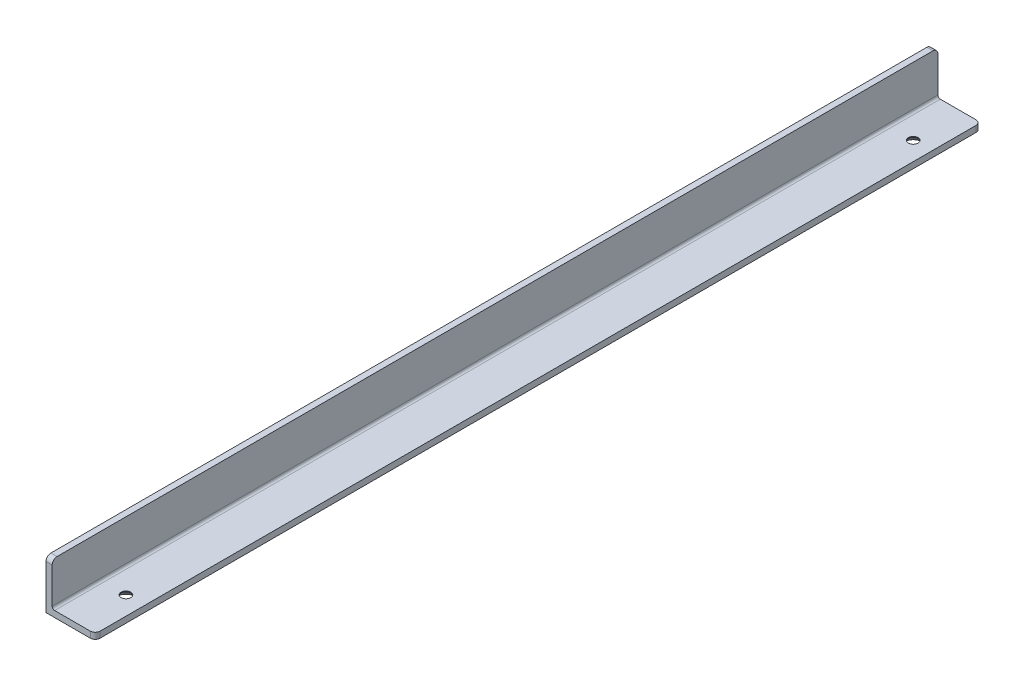
ISO-10303-21;
HEADER;
FILE_DESCRIPTION(('STEP AP214'),'2;1');
FILE_NAME('part.step','',(''),(''),'','','');
FILE_SCHEMA(('AUTOMOTIVE_DESIGN { 1 0 10303 214 1 1 1 1 }'));
ENDSEC;
DATA;
#1=APPLICATION_CONTEXT('core data for automotive mechanical design processes');
#2=APPLICATION_PROTOCOL_DEFINITION('international standard','automotive_design',2000,#1);
#3=PRODUCT_CONTEXT('',#1,'mechanical');
#4=PRODUCT('Part','Part','',(#3));
#5=PRODUCT_RELATED_PRODUCT_CATEGORY('part','',(#4));
#6=PRODUCT_DEFINITION_FORMATION('','',#4);
#7=PRODUCT_DEFINITION_CONTEXT('part definition',#1,'design');
#8=PRODUCT_DEFINITION('design','',#6,#7);
#9=PRODUCT_DEFINITION_SHAPE('','',#8);
#10=(LENGTH_UNIT() NAMED_UNIT(*) SI_UNIT(.MILLI.,.METRE.));
#11=(NAMED_UNIT(*) PLANE_ANGLE_UNIT() SI_UNIT($,.RADIAN.));
#12=(NAMED_UNIT(*) SI_UNIT($,.STERADIAN.) SOLID_ANGLE_UNIT());
#13=UNCERTAINTY_MEASURE_WITH_UNIT(LENGTH_MEASURE(1.E-05),#10,'distance_accuracy_value','');
#14=(GEOMETRIC_REPRESENTATION_CONTEXT(3) GLOBAL_UNCERTAINTY_ASSIGNED_CONTEXT((#13)) GLOBAL_UNIT_ASSIGNED_CONTEXT((#10,
#11,#12)) REPRESENTATION_CONTEXT('',''));
#15=CARTESIAN_POINT('',(0.,0.,0.));
#16=DIRECTION('',(0.,0.,1.));
#17=DIRECTION('',(1.,0.,0.));
#18=AXIS2_PLACEMENT_3D('',#15,#16,#17);
#19=CARTESIAN_POINT('',(0.,25.400000027292,228.6));
#20=DIRECTION('',(1.,0.,0.));
#21=DIRECTION('',(0.,0.,-1.));
#22=AXIS2_PLACEMENT_3D('',#19,#20,#21);
#23=PLANE('',#22);
#24=DIRECTION('',(0.,0.,-1.));
#25=VECTOR('',#24,1.);
#26=CARTESIAN_POINT('',(0.,25.400000027292,228.6));
#27=LINE('',#26,#25);
#28=CARTESIAN_POINT('',(0.,25.400000027292,226.06));
#29=VERTEX_POINT('',#28);
#30=CARTESIAN_POINT('',(0.,25.400000027292,-226.06));
#31=VERTEX_POINT('',#30);
#32=EDGE_CURVE('E189',#29,#31,#27,.T.);
#33=ORIENTED_EDGE('',*,*,#32,.T.);
#34=CARTESIAN_POINT('',(0.,22.860000027292,-226.06));
#35=DIRECTION('',(1.,0.,0.));
#36=DIRECTION('',(0.,0.,-1.));
#37=AXIS2_PLACEMENT_3D('',#34,#35,#36);
#38=CIRCLE('',#37,2.54);
#39=CARTESIAN_POINT('',(0.,22.860000027292,-228.6));
#40=VERTEX_POINT('',#39);
#41=EDGE_CURVE('E171',#31,#40,#38,.F.);
#42=ORIENTED_EDGE('',*,*,#41,.T.);
#43=DIRECTION('',(0.,-1.,0.));
#44=VECTOR('',#43,1.);
#45=CARTESIAN_POINT('',(0.,25.400000027292,-228.6));
#46=LINE('',#45,#44);
#47=CARTESIAN_POINT('',(0.,0.,-228.6));
#48=VERTEX_POINT('',#47);
#49=EDGE_CURVE('E140',#40,#48,#46,.T.);
#50=ORIENTED_EDGE('',*,*,#49,.T.);
#51=DIRECTION('',(0.,0.,-1.));
#52=VECTOR('',#51,1.);
#53=CARTESIAN_POINT('',(0.,0.,228.6));
#54=LINE('',#53,#52);
#55=CARTESIAN_POINT('',(0.,0.,228.6));
#56=VERTEX_POINT('',#55);
#57=EDGE_CURVE('E132',#56,#48,#54,.T.);
#58=ORIENTED_EDGE('',*,*,#57,.F.);
#59=DIRECTION('',(0.,-1.,0.));
#60=VECTOR('',#59,1.);
#61=CARTESIAN_POINT('',(0.,25.400000027292,228.6));
#62=LINE('',#61,#60);
#63=CARTESIAN_POINT('',(0.,22.860000027292,228.6));
#64=VERTEX_POINT('',#63);
#65=EDGE_CURVE('E119',#64,#56,#62,.T.);
#66=ORIENTED_EDGE('',*,*,#65,.F.);
#67=CARTESIAN_POINT('',(0.,22.860000027292,226.06));
#68=DIRECTION('',(1.,0.,0.));
#69=DIRECTION('',(0.,0.,-1.));
#70=AXIS2_PLACEMENT_3D('',#67,#68,#69);
#71=CIRCLE('',#70,2.54);
#72=EDGE_CURVE('E56',#64,#29,#71,.F.);
#73=ORIENTED_EDGE('',*,*,#72,.T.);
#74=EDGE_LOOP('',(#33,#42,#50,#58,#66,#73));
#75=FACE_BOUND('',#74,.T.);
#76=ADVANCED_FACE('F33',(#75),#23,.F.);
#77=CARTESIAN_POINT('',(0.,0.,228.6));
#78=DIRECTION('',(0.,1.,0.));
#79=DIRECTION('',(-1.,0.,0.));
#80=AXIS2_PLACEMENT_3D('',#77,#78,#79);
#81=PLANE('',#80);
#82=CARTESIAN_POINT('',(15.875,0.,203.2));
#83=DIRECTION('',(0.,-1.,0.));
#84=DIRECTION('',(0.,0.,-1.));
#85=AXIS2_PLACEMENT_3D('',#82,#83,#84);
#86=CIRCLE('',#85,4.8895);
#87=CARTESIAN_POINT('',(15.875,0.,198.3105));
#88=VERTEX_POINT('',#87);
#89=EDGE_CURVE('E242',#88,#88,#86,.T.);
#90=ORIENTED_EDGE('',*,*,#89,.F.);
#91=EDGE_LOOP('',(#90));
#92=FACE_BOUND('',#91,.T.);
#93=CARTESIAN_POINT('',(15.875,0.,-203.2));
#94=DIRECTION('',(0.,-1.,0.));
#95=DIRECTION('',(0.,0.,-1.));
#96=AXIS2_PLACEMENT_3D('',#93,#94,#95);
#97=CIRCLE('',#96,4.8895);
#98=CARTESIAN_POINT('',(15.875,0.,-208.0895));
#99=VERTEX_POINT('',#98);
#100=EDGE_CURVE('E233',#99,#99,#97,.T.);
#101=ORIENTED_EDGE('',*,*,#100,.F.);
#102=EDGE_LOOP('',(#101));
#103=FACE_BOUND('',#102,.T.);
#104=DIRECTION('',(1.,0.,0.));
#105=VECTOR('',#104,1.);
#106=CARTESIAN_POINT('',(0.,0.,-228.6));
#107=LINE('',#106,#105);
#108=CARTESIAN_POINT('',(22.86,0.,-228.6));
#109=VERTEX_POINT('',#108);
#110=EDGE_CURVE('E195',#48,#109,#107,.T.);
#111=ORIENTED_EDGE('',*,*,#110,.T.);
#112=CARTESIAN_POINT('',(22.86,0.,-226.06));
#113=DIRECTION('',(0.,1.,0.));
#114=DIRECTION('',(-1.,0.,0.));
#115=AXIS2_PLACEMENT_3D('',#112,#113,#114);
#116=CIRCLE('',#115,2.54);
#117=CARTESIAN_POINT('',(25.4,0.,-226.06));
#118=VERTEX_POINT('',#117);
#119=EDGE_CURVE('E163',#109,#118,#116,.F.);
#120=ORIENTED_EDGE('',*,*,#119,.T.);
#121=DIRECTION('',(0.,0.,-1.));
#122=VECTOR('',#121,1.);
#123=CARTESIAN_POINT('',(25.4,0.,228.6));
#124=LINE('',#123,#122);
#125=CARTESIAN_POINT('',(25.4,0.,226.06));
#126=VERTEX_POINT('',#125);
#127=EDGE_CURVE('E143',#126,#118,#124,.T.);
#128=ORIENTED_EDGE('',*,*,#127,.F.);
#129=CARTESIAN_POINT('',(22.86,0.,226.06));
#130=DIRECTION('',(0.,1.,0.));
#131=DIRECTION('',(-1.,0.,0.));
#132=AXIS2_PLACEMENT_3D('',#129,#130,#131);
#133=CIRCLE('',#132,2.54);
#134=CARTESIAN_POINT('',(22.86,0.,228.6));
#135=VERTEX_POINT('',#134);
#136=EDGE_CURVE('E135',#126,#135,#133,.F.);
#137=ORIENTED_EDGE('',*,*,#136,.T.);
#138=DIRECTION('',(1.,0.,0.));
#139=VECTOR('',#138,1.);
#140=CARTESIAN_POINT('',(0.,0.,228.6));
#141=LINE('',#140,#139);
#142=EDGE_CURVE('E122',#56,#135,#141,.T.);
#143=ORIENTED_EDGE('',*,*,#142,.F.);
#144=ORIENTED_EDGE('',*,*,#57,.T.);
#145=EDGE_LOOP('',(#111,#120,#128,#137,#143,#144));
#146=FACE_BOUND('',#145,.T.);
#147=ADVANCED_FACE('F131',(#92,#103,#146),#81,.F.);
#148=CARTESIAN_POINT('',(25.4,3.175,228.6));
#149=DIRECTION('',(-1.,0.,0.));
#150=DIRECTION('',(0.,0.,1.));
#151=AXIS2_PLACEMENT_3D('',#148,#149,#150);
#152=PLANE('',#151);
#153=ORIENTED_EDGE('',*,*,#127,.T.);
#154=DIRECTION('',(0.,1.,0.));
#155=VECTOR('',#154,1.);
#156=CARTESIAN_POINT('',(25.4,3.175,-226.06));
#157=LINE('',#156,#155);
#158=CARTESIAN_POINT('',(25.4,3.175,-226.06));
#159=VERTEX_POINT('',#158);
#160=EDGE_CURVE('E145',#118,#159,#157,.T.);
#161=ORIENTED_EDGE('',*,*,#160,.T.);
#162=DIRECTION('',(0.,0.,-1.));
#163=VECTOR('',#162,1.);
#164=CARTESIAN_POINT('',(25.4,3.175,228.6));
#165=LINE('',#164,#163);
#166=CARTESIAN_POINT('',(25.4,3.175,226.06));
#167=VERTEX_POINT('',#166);
#168=EDGE_CURVE('E148',#167,#159,#165,.T.);
#169=ORIENTED_EDGE('',*,*,#168,.F.);
#170=DIRECTION('',(0.,1.,0.));
#171=VECTOR('',#170,1.);
#172=CARTESIAN_POINT('',(25.4,3.175,226.06));
#173=LINE('',#172,#171);
#174=EDGE_CURVE('E142',#167,#126,#173,.F.);
#175=ORIENTED_EDGE('',*,*,#174,.T.);
#176=EDGE_LOOP('',(#153,#161,#169,#175));
#177=FACE_BOUND('',#176,.T.);
#178=ADVANCED_FACE('F222',(#177),#152,.F.);
#179=CARTESIAN_POINT('',(25.4,3.175,228.6));
#180=DIRECTION('',(0.,-1.,0.));
#181=DIRECTION('',(1.,0.,0.));
#182=AXIS2_PLACEMENT_3D('',#179,#180,#181);
#183=PLANE('',#182);
#184=CARTESIAN_POINT('',(15.875,3.175,203.2));
#185=DIRECTION('',(0.,-1.,0.));
#186=DIRECTION('',(1.,0.,0.));
#187=AXIS2_PLACEMENT_3D('',#184,#185,#186);
#188=CIRCLE('',#187,2.4892);
#189=CARTESIAN_POINT('',(18.3642,3.175,203.2));
#190=VERTEX_POINT('',#189);
#191=EDGE_CURVE('E236',#190,#190,#188,.T.);
#192=ORIENTED_EDGE('',*,*,#191,.T.);
#193=EDGE_LOOP('',(#192));
#194=FACE_BOUND('',#193,.T.);
#195=CARTESIAN_POINT('',(15.875,3.175,-203.2));
#196=DIRECTION('',(0.,-1.,0.));
#197=DIRECTION('',(1.,0.,0.));
#198=AXIS2_PLACEMENT_3D('',#195,#196,#197);
#199=CIRCLE('',#198,2.4892);
#200=CARTESIAN_POINT('',(18.3642,3.175,-203.2));
#201=VERTEX_POINT('',#200);
#202=EDGE_CURVE('E196',#201,#201,#199,.T.);
#203=ORIENTED_EDGE('',*,*,#202,.T.);
#204=EDGE_LOOP('',(#203));
#205=FACE_BOUND('',#204,.T.);
#206=ORIENTED_EDGE('',*,*,#168,.T.);
#207=CARTESIAN_POINT('',(22.86,3.175,-226.06));
#208=DIRECTION('',(0.,-1.,0.));
#209=DIRECTION('',(1.,0.,0.));
#210=AXIS2_PLACEMENT_3D('',#207,#208,#209);
#211=CIRCLE('',#210,2.54);
#212=CARTESIAN_POINT('',(22.86,3.175,-228.6));
#213=VERTEX_POINT('',#212);
#214=EDGE_CURVE('E156',#159,#213,#211,.F.);
#215=ORIENTED_EDGE('',*,*,#214,.T.);
#216=DIRECTION('',(-1.,0.,0.));
#217=VECTOR('',#216,1.);
#218=CARTESIAN_POINT('',(25.4,3.175,-228.6));
#219=LINE('',#218,#217);
#220=CARTESIAN_POINT('',(4.445,3.175,-228.6));
#221=VERTEX_POINT('',#220);
#222=EDGE_CURVE('E198',#213,#221,#219,.T.);
#223=ORIENTED_EDGE('',*,*,#222,.T.);
#224=DIRECTION('',(0.,0.,-1.));
#225=VECTOR('',#224,1.);
#226=CARTESIAN_POINT('',(4.445,3.175,228.6));
#227=LINE('',#226,#225);
#228=CARTESIAN_POINT('',(4.445,3.175,228.6));
#229=VERTEX_POINT('',#228);
#230=EDGE_CURVE('E213',#229,#221,#227,.T.);
#231=ORIENTED_EDGE('',*,*,#230,.F.);
#232=DIRECTION('',(-1.,0.,0.));
#233=VECTOR('',#232,1.);
#234=CARTESIAN_POINT('',(25.4,3.175,228.6));
#235=LINE('',#234,#233);
#236=CARTESIAN_POINT('',(22.86,3.175,228.6));
#237=VERTEX_POINT('',#236);
#238=EDGE_CURVE('E136',#237,#229,#235,.T.);
#239=ORIENTED_EDGE('',*,*,#238,.F.);
#240=CARTESIAN_POINT('',(22.86,3.175,226.06));
#241=DIRECTION('',(0.,-1.,0.));
#242=DIRECTION('',(1.,0.,0.));
#243=AXIS2_PLACEMENT_3D('',#240,#241,#242);
#244=CIRCLE('',#243,2.54);
#245=EDGE_CURVE('E154',#237,#167,#244,.F.);
#246=ORIENTED_EDGE('',*,*,#245,.T.);
#247=EDGE_LOOP('',(#206,#215,#223,#231,#239,#246));
#248=FACE_BOUND('',#247,.T.);
#249=ADVANCED_FACE('F218',(#194,#205,#248),#183,.F.);
#250=CARTESIAN_POINT('',(4.445,4.445,228.6));
#251=DIRECTION('',(0.,0.,-1.));
#252=DIRECTION('',(-1.,0.,0.));
#253=AXIS2_PLACEMENT_3D('',#250,#251,#252);
#254=CYLINDRICAL_SURFACE('',#253,1.27);
#255=CARTESIAN_POINT('',(4.445,4.445,-228.6));
#256=DIRECTION('',(0.,0.,-1.));
#257=DIRECTION('',(-1.,0.,0.));
#258=AXIS2_PLACEMENT_3D('',#255,#256,#257);
#259=CIRCLE('',#258,1.27);
#260=CARTESIAN_POINT('',(3.175,4.445,-228.6));
#261=VERTEX_POINT('',#260);
#262=EDGE_CURVE('E208',#221,#261,#259,.T.);
#263=ORIENTED_EDGE('',*,*,#262,.T.);
#264=DIRECTION('',(0.,0.,-1.));
#265=VECTOR('',#264,1.);
#266=CARTESIAN_POINT('',(3.175,4.445,228.6));
#267=LINE('',#266,#265);
#268=CARTESIAN_POINT('',(3.175,4.445,228.6));
#269=VERTEX_POINT('',#268);
#270=EDGE_CURVE('E188',#269,#261,#267,.T.);
#271=ORIENTED_EDGE('',*,*,#270,.F.);
#272=CARTESIAN_POINT('',(4.445,4.445,228.6));
#273=DIRECTION('',(0.,0.,-1.));
#274=DIRECTION('',(-1.,0.,0.));
#275=AXIS2_PLACEMENT_3D('',#272,#273,#274);
#276=CIRCLE('',#275,1.27);
#277=EDGE_CURVE('E228',#229,#269,#276,.T.);
#278=ORIENTED_EDGE('',*,*,#277,.F.);
#279=ORIENTED_EDGE('',*,*,#230,.T.);
#280=EDGE_LOOP('',(#263,#271,#278,#279));
#281=FACE_BOUND('',#280,.T.);
#282=ADVANCED_FACE('F337',(#281),#254,.F.);
#283=CARTESIAN_POINT('',(3.175,4.445,228.6));
#284=DIRECTION('',(-1.,0.,0.));
#285=DIRECTION('',(0.,0.,1.));
#286=AXIS2_PLACEMENT_3D('',#283,#284,#285);
#287=PLANE('',#286);
#288=DIRECTION('',(0.,1.,0.));
#289=VECTOR('',#288,1.);
#290=CARTESIAN_POINT('',(3.175,4.445,-228.6));
#291=LINE('',#290,#289);
#292=CARTESIAN_POINT('',(3.175,22.860000027292,-228.6));
#293=VERTEX_POINT('',#292);
#294=EDGE_CURVE('E126',#261,#293,#291,.T.);
#295=ORIENTED_EDGE('',*,*,#294,.T.);
#296=CARTESIAN_POINT('',(3.175,22.860000027292,-226.06));
#297=DIRECTION('',(-1.,0.,0.));
#298=DIRECTION('',(0.,0.,1.));
#299=AXIS2_PLACEMENT_3D('',#296,#297,#298);
#300=CIRCLE('',#299,2.54);
#301=CARTESIAN_POINT('',(3.175,25.400000027292,-226.06));
#302=VERTEX_POINT('',#301);
#303=EDGE_CURVE('E174',#293,#302,#300,.F.);
#304=ORIENTED_EDGE('',*,*,#303,.T.);
#305=DIRECTION('',(0.,0.,-1.));
#306=VECTOR('',#305,1.);
#307=CARTESIAN_POINT('',(3.175,25.400000027292,228.6));
#308=LINE('',#307,#306);
#309=CARTESIAN_POINT('',(3.175,25.400000027292,226.06));
#310=VERTEX_POINT('',#309);
#311=EDGE_CURVE('E179',#310,#302,#308,.T.);
#312=ORIENTED_EDGE('',*,*,#311,.F.);
#313=CARTESIAN_POINT('',(3.175,22.860000027292,226.06));
#314=DIRECTION('',(-1.,0.,0.));
#315=DIRECTION('',(0.,0.,1.));
#316=AXIS2_PLACEMENT_3D('',#313,#314,#315);
#317=CIRCLE('',#316,2.54);
#318=CARTESIAN_POINT('',(3.175,22.860000027292,228.6));
#319=VERTEX_POINT('',#318);
#320=EDGE_CURVE('E48',#310,#319,#317,.F.);
#321=ORIENTED_EDGE('',*,*,#320,.T.);
#322=DIRECTION('',(0.,1.,0.));
#323=VECTOR('',#322,1.);
#324=CARTESIAN_POINT('',(3.175,4.445,228.6));
#325=LINE('',#324,#323);
#326=EDGE_CURVE('E204',#269,#319,#325,.T.);
#327=ORIENTED_EDGE('',*,*,#326,.F.);
#328=ORIENTED_EDGE('',*,*,#270,.T.);
#329=EDGE_LOOP('',(#295,#304,#312,#321,#327,#328));
#330=FACE_BOUND('',#329,.T.);
#331=ADVANCED_FACE('F178',(#330),#287,.F.);
#332=CARTESIAN_POINT('',(0.,25.400000027292,228.6));
#333=DIRECTION('',(0.,-1.,0.));
#334=DIRECTION('',(0.,0.,-1.));
#335=AXIS2_PLACEMENT_3D('',#332,#333,#334);
#336=PLANE('',#335);
#337=ORIENTED_EDGE('',*,*,#311,.T.);
#338=DIRECTION('',(-1.,0.,0.));
#339=VECTOR('',#338,1.);
#340=CARTESIAN_POINT('',(0.,25.400000027292,-226.06));
#341=LINE('',#340,#339);
#342=EDGE_CURVE('E167',#302,#31,#341,.T.);
#343=ORIENTED_EDGE('',*,*,#342,.T.);
#344=ORIENTED_EDGE('',*,*,#32,.F.);
#345=DIRECTION('',(-1.,0.,0.));
#346=VECTOR('',#345,1.);
#347=CARTESIAN_POINT('',(0.,25.400000027292,226.06));
#348=LINE('',#347,#346);
#349=EDGE_CURVE('E165',#29,#310,#348,.F.);
#350=ORIENTED_EDGE('',*,*,#349,.T.);
#351=EDGE_LOOP('',(#337,#343,#344,#350));
#352=FACE_BOUND('',#351,.T.);
#353=ADVANCED_FACE('F186',(#352),#336,.F.);
#354=CARTESIAN_POINT('',(4.445,4.445,228.6));
#355=DIRECTION('',(0.,0.,-1.));
#356=DIRECTION('',(-1.,0.,0.));
#357=AXIS2_PLACEMENT_3D('',#354,#355,#356);
#358=PLANE('',#357);
#359=ORIENTED_EDGE('',*,*,#142,.T.);
#360=DIRECTION('',(0.,1.,0.));
#361=VECTOR('',#360,1.);
#362=CARTESIAN_POINT('',(22.86,4.445,228.6));
#363=LINE('',#362,#361);
#364=EDGE_CURVE('E11',#135,#237,#363,.T.);
#365=ORIENTED_EDGE('',*,*,#364,.T.);
#366=ORIENTED_EDGE('',*,*,#238,.T.);
#367=ORIENTED_EDGE('',*,*,#277,.T.);
#368=ORIENTED_EDGE('',*,*,#326,.T.);
#369=DIRECTION('',(-1.,0.,0.));
#370=VECTOR('',#369,1.);
#371=CARTESIAN_POINT('',(4.445,22.860000027292,228.6));
#372=LINE('',#371,#370);
#373=EDGE_CURVE('E41',#319,#64,#372,.T.);
#374=ORIENTED_EDGE('',*,*,#373,.T.);
#375=ORIENTED_EDGE('',*,*,#65,.T.);
#376=EDGE_LOOP('',(#359,#365,#366,#367,#368,#374,#375));
#377=FACE_BOUND('',#376,.T.);
#378=ADVANCED_FACE('F121',(#377),#358,.F.);
#379=CARTESIAN_POINT('',(4.445,4.445,-228.6));
#380=DIRECTION('',(0.,0.,-1.));
#381=DIRECTION('',(-1.,0.,0.));
#382=AXIS2_PLACEMENT_3D('',#379,#380,#381);
#383=PLANE('',#382);
#384=ORIENTED_EDGE('',*,*,#222,.F.);
#385=DIRECTION('',(0.,1.,0.));
#386=VECTOR('',#385,1.);
#387=CARTESIAN_POINT('',(22.86,0.,-228.6));
#388=LINE('',#387,#386);
#389=EDGE_CURVE('E160',#213,#109,#388,.F.);
#390=ORIENTED_EDGE('',*,*,#389,.T.);
#391=ORIENTED_EDGE('',*,*,#110,.F.);
#392=ORIENTED_EDGE('',*,*,#49,.F.);
#393=DIRECTION('',(-1.,0.,0.));
#394=VECTOR('',#393,1.);
#395=CARTESIAN_POINT('',(3.175,22.860000027292,-228.6));
#396=LINE('',#395,#394);
#397=EDGE_CURVE('E158',#40,#293,#396,.F.);
#398=ORIENTED_EDGE('',*,*,#397,.T.);
#399=ORIENTED_EDGE('',*,*,#294,.F.);
#400=ORIENTED_EDGE('',*,*,#262,.F.);
#401=EDGE_LOOP('',(#384,#390,#391,#392,#398,#399,#400));
#402=FACE_BOUND('',#401,.T.);
#403=ADVANCED_FACE('F194',(#402),#383,.T.);
#404=CARTESIAN_POINT('',(15.875,0.,-203.2));
#405=DIRECTION('',(0.,-1.,0.));
#406=DIRECTION('',(0.,0.,-1.));
#407=AXIS2_PLACEMENT_3D('',#404,#405,#406);
#408=CYLINDRICAL_SURFACE('',#407,2.4892);
#409=ORIENTED_EDGE('',*,*,#202,.F.);
#410=EDGE_LOOP('',(#409));
#411=FACE_BOUND('',#410,.T.);
#412=CARTESIAN_POINT('',(15.875,2.76122928785259,-203.2));
#413=DIRECTION('',(0.,-1.,0.));
#414=DIRECTION('',(0.,0.,-1.));
#415=AXIS2_PLACEMENT_3D('',#412,#413,#414);
#416=CIRCLE('',#415,2.4892);
#417=CARTESIAN_POINT('',(15.875,2.76122928785259,-205.6892));
#418=VERTEX_POINT('',#417);
#419=EDGE_CURVE('E201',#418,#418,#416,.T.);
#420=ORIENTED_EDGE('',*,*,#419,.T.);
#421=EDGE_LOOP('',(#420));
#422=FACE_BOUND('',#421,.T.);
#423=ADVANCED_FACE('F256',(#411,#422),#408,.F.);
#424=CARTESIAN_POINT('',(15.875,0.,-203.2));
#425=DIRECTION('',(0.,-1.,0.));
#426=DIRECTION('',(0.,0.,-1.));
#427=AXIS2_PLACEMENT_3D('',#424,#425,#426);
#428=CONICAL_SURFACE('',#427,4.8895,0.715584993317675);
#429=ORIENTED_EDGE('',*,*,#419,.F.);
#430=EDGE_LOOP('',(#429));
#431=FACE_BOUND('',#430,.T.);
#432=ORIENTED_EDGE('',*,*,#100,.T.);
#433=EDGE_LOOP('',(#432));
#434=FACE_BOUND('',#433,.T.);
#435=ADVANCED_FACE('F253',(#431,#434),#428,.F.);
#436=CARTESIAN_POINT('',(15.875,0.,203.2));
#437=DIRECTION('',(0.,-1.,0.));
#438=DIRECTION('',(0.,0.,-1.));
#439=AXIS2_PLACEMENT_3D('',#436,#437,#438);
#440=CYLINDRICAL_SURFACE('',#439,2.4892);
#441=ORIENTED_EDGE('',*,*,#191,.F.);
#442=EDGE_LOOP('',(#441));
#443=FACE_BOUND('',#442,.T.);
#444=CARTESIAN_POINT('',(15.875,2.76122928785259,203.2));
#445=DIRECTION('',(0.,-1.,0.));
#446=DIRECTION('',(0.,0.,-1.));
#447=AXIS2_PLACEMENT_3D('',#444,#445,#446);
#448=CIRCLE('',#447,2.4892);
#449=CARTESIAN_POINT('',(15.875,2.76122928785259,200.7108));
#450=VERTEX_POINT('',#449);
#451=EDGE_CURVE('E239',#450,#450,#448,.T.);
#452=ORIENTED_EDGE('',*,*,#451,.T.);
#453=EDGE_LOOP('',(#452));
#454=FACE_BOUND('',#453,.T.);
#455=ADVANCED_FACE('F255',(#443,#454),#440,.F.);
#456=CARTESIAN_POINT('',(15.875,0.,203.2));
#457=DIRECTION('',(0.,-1.,0.));
#458=DIRECTION('',(0.,0.,-1.));
#459=AXIS2_PLACEMENT_3D('',#456,#457,#458);
#460=CONICAL_SURFACE('',#459,4.8895,0.715584993317675);
#461=ORIENTED_EDGE('',*,*,#451,.F.);
#462=EDGE_LOOP('',(#461));
#463=FACE_BOUND('',#462,.T.);
#464=ORIENTED_EDGE('',*,*,#89,.T.);
#465=EDGE_LOOP('',(#464));
#466=FACE_BOUND('',#465,.T.);
#467=ADVANCED_FACE('F246',(#463,#466),#460,.F.);
#468=CARTESIAN_POINT('',(22.86,3.175,-226.06));
#469=DIRECTION('',(0.,-1.,0.));
#470=DIRECTION('',(0.,0.,-1.));
#471=AXIS2_PLACEMENT_3D('',#468,#469,#470);
#472=CYLINDRICAL_SURFACE('',#471,2.54);
#473=ORIENTED_EDGE('',*,*,#119,.F.);
#474=ORIENTED_EDGE('',*,*,#389,.F.);
#475=ORIENTED_EDGE('',*,*,#214,.F.);
#476=ORIENTED_EDGE('',*,*,#160,.F.);
#477=EDGE_LOOP('',(#473,#474,#475,#476));
#478=FACE_BOUND('',#477,.T.);
#479=ADVANCED_FACE('F274',(#478),#472,.T.);
#480=CARTESIAN_POINT('',(0.,22.860000027292,-226.06));
#481=DIRECTION('',(1.,0.,0.));
#482=DIRECTION('',(0.,0.,-1.));
#483=AXIS2_PLACEMENT_3D('',#480,#481,#482);
#484=CYLINDRICAL_SURFACE('',#483,2.54);
#485=ORIENTED_EDGE('',*,*,#303,.F.);
#486=ORIENTED_EDGE('',*,*,#397,.F.);
#487=ORIENTED_EDGE('',*,*,#41,.F.);
#488=ORIENTED_EDGE('',*,*,#342,.F.);
#489=EDGE_LOOP('',(#485,#486,#487,#488));
#490=FACE_BOUND('',#489,.T.);
#491=ADVANCED_FACE('F191',(#490),#484,.T.);
#492=CARTESIAN_POINT('',(22.86,4.445,226.06));
#493=DIRECTION('',(0.,1.,0.));
#494=DIRECTION('',(0.,0.,1.));
#495=AXIS2_PLACEMENT_3D('',#492,#493,#494);
#496=CYLINDRICAL_SURFACE('',#495,2.54);
#497=ORIENTED_EDGE('',*,*,#136,.F.);
#498=ORIENTED_EDGE('',*,*,#174,.F.);
#499=ORIENTED_EDGE('',*,*,#245,.F.);
#500=ORIENTED_EDGE('',*,*,#364,.F.);
#501=EDGE_LOOP('',(#497,#498,#499,#500));
#502=FACE_BOUND('',#501,.T.);
#503=ADVANCED_FACE('F225',(#502),#496,.T.);
#504=CARTESIAN_POINT('',(4.445,22.860000027292,226.06));
#505=DIRECTION('',(-1.,0.,0.));
#506=DIRECTION('',(0.,0.,1.));
#507=AXIS2_PLACEMENT_3D('',#504,#505,#506);
#508=CYLINDRICAL_SURFACE('',#507,2.54);
#509=ORIENTED_EDGE('',*,*,#320,.F.);
#510=ORIENTED_EDGE('',*,*,#349,.F.);
#511=ORIENTED_EDGE('',*,*,#72,.F.);
#512=ORIENTED_EDGE('',*,*,#373,.F.);
#513=EDGE_LOOP('',(#509,#510,#511,#512));
#514=FACE_BOUND('',#513,.T.);
#515=ADVANCED_FACE('F35',(#514),#508,.T.);
#516=CLOSED_SHELL('',(#76,#147,#178,#249,#282,#331,#353,#378,#403,#423,#435,#455,#467,#479,#491,
#503,#515));
#517=MANIFOLD_SOLID_BREP('B2',#516);
#518=ADVANCED_BREP_SHAPE_REPRESENTATION('',(#18,#517),#14);
#519=SHAPE_DEFINITION_REPRESENTATION(#9,#518);
ENDSEC;
END-ISO-10303-21;
